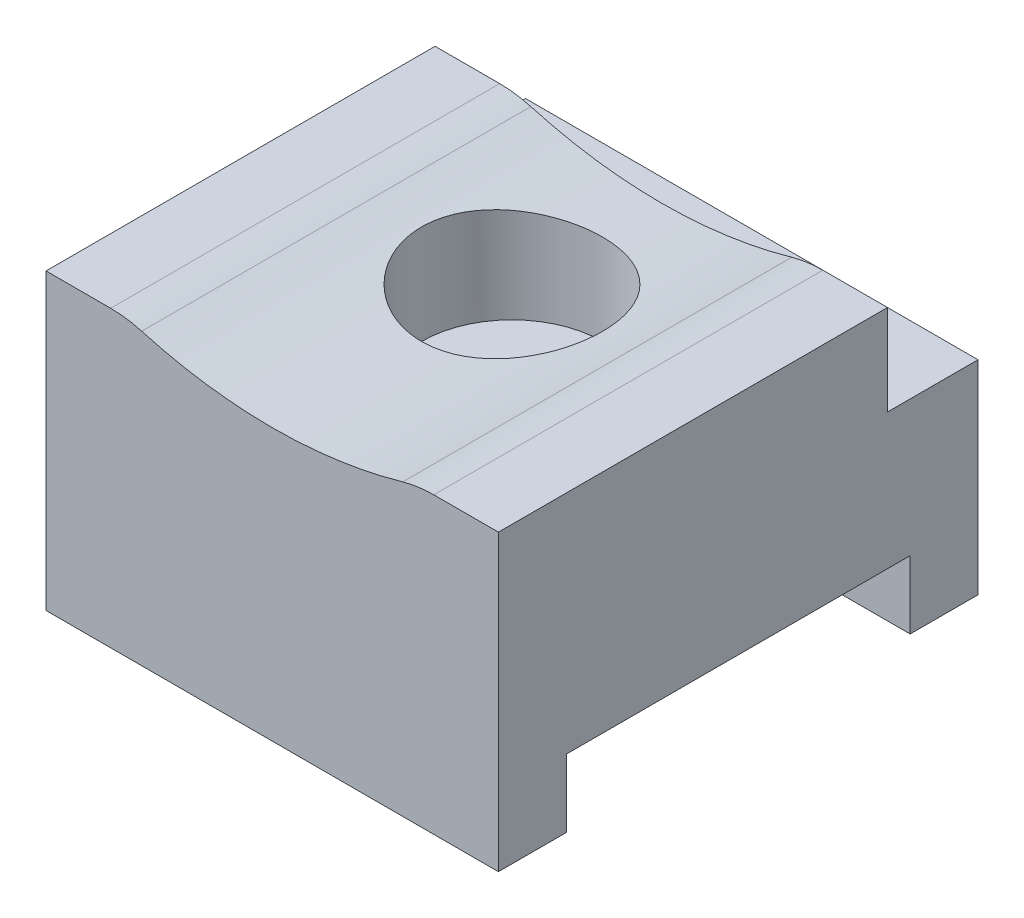
ISO-10303-21;
HEADER;
FILE_DESCRIPTION(('STEP AP214'),'2;1');
FILE_NAME('part.step','',(''),(''),'','','');
FILE_SCHEMA(('AUTOMOTIVE_DESIGN { 1 0 10303 214 1 1 1 1 }'));
ENDSEC;
DATA;
#1=APPLICATION_CONTEXT('core data for automotive mechanical design processes');
#2=APPLICATION_PROTOCOL_DEFINITION('international standard','automotive_design',2000,#1);
#3=PRODUCT_CONTEXT('',#1,'mechanical');
#4=PRODUCT('Part','Part','',(#3));
#5=PRODUCT_RELATED_PRODUCT_CATEGORY('part','',(#4));
#6=PRODUCT_DEFINITION_FORMATION('','',#4);
#7=PRODUCT_DEFINITION_CONTEXT('part definition',#1,'design');
#8=PRODUCT_DEFINITION('design','',#6,#7);
#9=PRODUCT_DEFINITION_SHAPE('','',#8);
#10=(LENGTH_UNIT() NAMED_UNIT(*) SI_UNIT(.MILLI.,.METRE.));
#11=(NAMED_UNIT(*) PLANE_ANGLE_UNIT() SI_UNIT($,.RADIAN.));
#12=(NAMED_UNIT(*) SI_UNIT($,.STERADIAN.) SOLID_ANGLE_UNIT());
#13=UNCERTAINTY_MEASURE_WITH_UNIT(LENGTH_MEASURE(1.E-05),#10,'distance_accuracy_value','');
#14=(GEOMETRIC_REPRESENTATION_CONTEXT(3) GLOBAL_UNCERTAINTY_ASSIGNED_CONTEXT((#13)) GLOBAL_UNIT_ASSIGNED_CONTEXT((#10,
#11,#12)) REPRESENTATION_CONTEXT('',''));
#15=CARTESIAN_POINT('',(0.,0.,0.));
#16=DIRECTION('',(0.,0.,1.));
#17=DIRECTION('',(1.,0.,0.));
#18=AXIS2_PLACEMENT_3D('',#15,#16,#17);
#19=CARTESIAN_POINT('',(10.,10.,0.));
#20=DIRECTION('',(0.,-1.,0.));
#21=DIRECTION('',(0.,0.,-1.));
#22=AXIS2_PLACEMENT_3D('',#19,#20,#21);
#23=CYLINDRICAL_SURFACE('',#22,1.6);
#24=CARTESIAN_POINT('',(10.,5.,0.));
#25=DIRECTION('',(0.,-1.,0.));
#26=DIRECTION('',(0.,0.,-1.));
#27=AXIS2_PLACEMENT_3D('',#24,#25,#26);
#28=CIRCLE('',#27,1.6);
#29=CARTESIAN_POINT('',(10.,5.,-1.6));
#30=VERTEX_POINT('',#29);
#31=EDGE_CURVE('E204',#30,#30,#28,.F.);
#32=ORIENTED_EDGE('',*,*,#31,.T.);
#33=EDGE_LOOP('',(#32));
#34=FACE_BOUND('',#33,.T.);
#35=CARTESIAN_POINT('',(10.,1.,0.));
#36=DIRECTION('',(0.,-1.,0.));
#37=DIRECTION('',(0.,0.,-1.));
#38=AXIS2_PLACEMENT_3D('',#35,#36,#37);
#39=CIRCLE('',#38,1.6);
#40=CARTESIAN_POINT('',(10.,1.,-1.6));
#41=VERTEX_POINT('',#40);
#42=EDGE_CURVE('E38',#41,#41,#39,.F.);
#43=ORIENTED_EDGE('',*,*,#42,.F.);
#44=EDGE_LOOP('',(#43));
#45=FACE_BOUND('',#44,.T.);
#46=ADVANCED_FACE('F34',(#34,#45),#23,.F.);
#47=CARTESIAN_POINT('',(20.,10.,10.6));
#48=DIRECTION('',(0.,-1.,0.));
#49=DIRECTION('',(0.,0.,-1.));
#50=AXIS2_PLACEMENT_3D('',#47,#48,#49);
#51=PLANE('',#50);
#52=DIRECTION('',(0.,0.,1.));
#53=VECTOR('',#52,1.);
#54=CARTESIAN_POINT('',(20.,10.,10.6));
#55=LINE('',#54,#53);
#56=CARTESIAN_POINT('',(20.,10.,-6.6));
#57=VERTEX_POINT('',#56);
#58=CARTESIAN_POINT('',(20.,10.,10.6));
#59=VERTEX_POINT('',#58);
#60=EDGE_CURVE('E266',#57,#59,#55,.T.);
#61=ORIENTED_EDGE('',*,*,#60,.F.);
#62=DIRECTION('',(1.,0.,0.));
#63=VECTOR('',#62,1.);
#64=CARTESIAN_POINT('',(0.,10.,-6.6));
#65=LINE('',#64,#63);
#66=CARTESIAN_POINT('',(17.1414284285428,10.,-6.6));
#67=VERTEX_POINT('',#66);
#68=EDGE_CURVE('E156',#67,#57,#65,.T.);
#69=ORIENTED_EDGE('',*,*,#68,.F.);
#70=DIRECTION('',(0.,0.,1.));
#71=VECTOR('',#70,1.);
#72=CARTESIAN_POINT('',(17.1414284285428,10.,10.6));
#73=LINE('',#72,#71);
#74=CARTESIAN_POINT('',(17.1414284285428,10.,10.6));
#75=VERTEX_POINT('',#74);
#76=EDGE_CURVE('E43',#67,#75,#73,.T.);
#77=ORIENTED_EDGE('',*,*,#76,.T.);
#78=DIRECTION('',(-1.,0.,0.));
#79=VECTOR('',#78,1.);
#80=CARTESIAN_POINT('',(20.,10.,10.6));
#81=LINE('',#80,#79);
#82=EDGE_CURVE('E201',#59,#75,#81,.T.);
#83=ORIENTED_EDGE('',*,*,#82,.F.);
#84=EDGE_LOOP('',(#61,#69,#77,#83));
#85=FACE_BOUND('',#84,.T.);
#86=ADVANCED_FACE('F228',(#85),#51,.F.);
#87=CARTESIAN_POINT('',(20.,10.,-10.6));
#88=DIRECTION('',(0.,0.,1.));
#89=DIRECTION('',(0.,-1.,0.));
#90=AXIS2_PLACEMENT_3D('',#87,#88,#89);
#91=PLANE('',#90);
#92=DIRECTION('',(0.,1.,0.));
#93=VECTOR('',#92,1.);
#94=CARTESIAN_POINT('',(0.,10.,-10.6));
#95=LINE('',#94,#93);
#96=CARTESIAN_POINT('',(0.,-3.,-10.6));
#97=VERTEX_POINT('',#96);
#98=CARTESIAN_POINT('',(0.,6.,-10.6));
#99=VERTEX_POINT('',#98);
#100=EDGE_CURVE('E162',#97,#99,#95,.T.);
#101=ORIENTED_EDGE('',*,*,#100,.T.);
#102=DIRECTION('',(1.,0.,0.));
#103=VECTOR('',#102,1.);
#104=CARTESIAN_POINT('',(0.,6.,-10.6));
#105=LINE('',#104,#103);
#106=CARTESIAN_POINT('',(20.,6.,-10.6));
#107=VERTEX_POINT('',#106);
#108=EDGE_CURVE('E253',#99,#107,#105,.T.);
#109=ORIENTED_EDGE('',*,*,#108,.T.);
#110=DIRECTION('',(0.,1.,0.));
#111=VECTOR('',#110,1.);
#112=CARTESIAN_POINT('',(20.,10.,-10.6));
#113=LINE('',#112,#111);
#114=CARTESIAN_POINT('',(20.,-3.,-10.6));
#115=VERTEX_POINT('',#114);
#116=EDGE_CURVE('E180',#115,#107,#113,.T.);
#117=ORIENTED_EDGE('',*,*,#116,.F.);
#118=DIRECTION('',(-1.,0.,0.));
#119=VECTOR('',#118,1.);
#120=CARTESIAN_POINT('',(20.,-3.,-10.6));
#121=LINE('',#120,#119);
#122=EDGE_CURVE('E181',#115,#97,#121,.T.);
#123=ORIENTED_EDGE('',*,*,#122,.T.);
#124=EDGE_LOOP('',(#101,#109,#117,#123));
#125=FACE_BOUND('',#124,.T.);
#126=ADVANCED_FACE('F233',(#125),#91,.F.);
#127=DIRECTION('',(0.,0.,1.));
#128=VECTOR('',#127,1.);
#129=CARTESIAN_POINT('',(2.85857157145716,10.,10.6));
#130=LINE('',#129,#128);
#131=CARTESIAN_POINT('',(2.85857157145716,10.,10.6));
#132=VERTEX_POINT('',#131);
#133=CARTESIAN_POINT('',(2.85857157145716,10.,-6.6));
#134=VERTEX_POINT('',#133);
#135=EDGE_CURVE('E155',#132,#134,#130,.F.);
#136=ORIENTED_EDGE('',*,*,#135,.T.);
#137=CARTESIAN_POINT('',(0.,10.,-6.6));
#138=VERTEX_POINT('',#137);
#139=EDGE_CURVE('E137',#138,#134,#65,.T.);
#140=ORIENTED_EDGE('',*,*,#139,.F.);
#141=DIRECTION('',(0.,0.,1.));
#142=VECTOR('',#141,1.);
#143=CARTESIAN_POINT('',(0.,10.,10.6));
#144=LINE('',#143,#142);
#145=CARTESIAN_POINT('',(0.,10.,10.6));
#146=VERTEX_POINT('',#145);
#147=EDGE_CURVE('E152',#138,#146,#144,.T.);
#148=ORIENTED_EDGE('',*,*,#147,.T.);
#149=EDGE_CURVE('E200',#132,#146,#81,.T.);
#150=ORIENTED_EDGE('',*,*,#149,.F.);
#151=EDGE_LOOP('',(#136,#140,#148,#150));
#152=FACE_BOUND('',#151,.T.);
#153=ADVANCED_FACE('F150',(#152),#51,.F.);
#154=CARTESIAN_POINT('',(20.,10.,10.6));
#155=DIRECTION('',(0.,0.,-1.));
#156=DIRECTION('',(0.,1.,0.));
#157=AXIS2_PLACEMENT_3D('',#154,#155,#156);
#158=PLANE('',#157);
#159=CARTESIAN_POINT('',(10.,30.,10.6));
#160=DIRECTION('',(0.,0.,1.));
#161=DIRECTION('',(1.,0.,0.));
#162=AXIS2_PLACEMENT_3D('',#159,#160,#161);
#163=CIRCLE('',#162,21.);
#164=CARTESIAN_POINT('',(4.23192319233079,9.80769230769231,10.6));
#165=VERTEX_POINT('',#164);
#166=CARTESIAN_POINT('',(15.7680768076692,9.80769230769231,10.6));
#167=VERTEX_POINT('',#166);
#168=EDGE_CURVE('E167',#165,#167,#163,.T.);
#169=ORIENTED_EDGE('',*,*,#168,.F.);
#170=CARTESIAN_POINT('',(2.85857157145716,5.,10.6));
#171=DIRECTION('',(0.,0.,-1.));
#172=DIRECTION('',(0.,1.,0.));
#173=AXIS2_PLACEMENT_3D('',#170,#171,#172);
#174=CIRCLE('',#173,5.);
#175=EDGE_CURVE('E315',#165,#132,#174,.F.);
#176=ORIENTED_EDGE('',*,*,#175,.T.);
#177=ORIENTED_EDGE('',*,*,#149,.T.);
#178=DIRECTION('',(0.,-1.,0.));
#179=VECTOR('',#178,1.);
#180=CARTESIAN_POINT('',(0.,10.,10.6));
#181=LINE('',#180,#179);
#182=CARTESIAN_POINT('',(0.,-3.,10.6));
#183=VERTEX_POINT('',#182);
#184=EDGE_CURVE('E161',#146,#183,#181,.T.);
#185=ORIENTED_EDGE('',*,*,#184,.T.);
#186=DIRECTION('',(-1.,0.,0.));
#187=VECTOR('',#186,1.);
#188=CARTESIAN_POINT('',(20.,-3.,10.6));
#189=LINE('',#188,#187);
#190=CARTESIAN_POINT('',(20.,-3.,10.6));
#191=VERTEX_POINT('',#190);
#192=EDGE_CURVE('E197',#191,#183,#189,.T.);
#193=ORIENTED_EDGE('',*,*,#192,.F.);
#194=DIRECTION('',(0.,-1.,0.));
#195=VECTOR('',#194,1.);
#196=CARTESIAN_POINT('',(20.,10.,10.6));
#197=LINE('',#196,#195);
#198=EDGE_CURVE('E268',#59,#191,#197,.T.);
#199=ORIENTED_EDGE('',*,*,#198,.F.);
#200=ORIENTED_EDGE('',*,*,#82,.T.);
#201=CARTESIAN_POINT('',(17.1414284285428,5.,10.6));
#202=DIRECTION('',(0.,0.,-1.));
#203=DIRECTION('',(0.,1.,0.));
#204=AXIS2_PLACEMENT_3D('',#201,#202,#203);
#205=CIRCLE('',#204,5.);
#206=EDGE_CURVE('E324',#75,#167,#205,.F.);
#207=ORIENTED_EDGE('',*,*,#206,.T.);
#208=EDGE_LOOP('',(#169,#176,#177,#185,#193,#199,#200,#207));
#209=FACE_BOUND('',#208,.T.);
#210=ADVANCED_FACE('F313',(#209),#158,.F.);
#211=CARTESIAN_POINT('',(20.,-3.,10.6));
#212=DIRECTION('',(0.,1.,0.));
#213=DIRECTION('',(0.,0.,1.));
#214=AXIS2_PLACEMENT_3D('',#211,#212,#213);
#215=PLANE('',#214);
#216=DIRECTION('',(0.,0.,-1.));
#217=VECTOR('',#216,1.);
#218=CARTESIAN_POINT('',(0.,-3.,10.6));
#219=LINE('',#218,#217);
#220=CARTESIAN_POINT('',(0.,-3.,7.6));
#221=VERTEX_POINT('',#220);
#222=EDGE_CURVE('E164',#183,#221,#219,.T.);
#223=ORIENTED_EDGE('',*,*,#222,.T.);
#224=DIRECTION('',(-1.,0.,0.));
#225=VECTOR('',#224,1.);
#226=CARTESIAN_POINT('',(20.,-3.,7.6));
#227=LINE('',#226,#225);
#228=CARTESIAN_POINT('',(20.,-3.,7.6));
#229=VERTEX_POINT('',#228);
#230=EDGE_CURVE('E194',#229,#221,#227,.T.);
#231=ORIENTED_EDGE('',*,*,#230,.F.);
#232=DIRECTION('',(0.,0.,-1.));
#233=VECTOR('',#232,1.);
#234=CARTESIAN_POINT('',(20.,-3.,10.6));
#235=LINE('',#234,#233);
#236=EDGE_CURVE('E270',#191,#229,#235,.T.);
#237=ORIENTED_EDGE('',*,*,#236,.F.);
#238=ORIENTED_EDGE('',*,*,#192,.T.);
#239=EDGE_LOOP('',(#223,#231,#237,#238));
#240=FACE_BOUND('',#239,.T.);
#241=ADVANCED_FACE('F307',(#240),#215,.F.);
#242=CARTESIAN_POINT('',(20.,-3.,7.6));
#243=DIRECTION('',(0.,0.,1.));
#244=DIRECTION('',(1.,0.,0.));
#245=AXIS2_PLACEMENT_3D('',#242,#243,#244);
#246=PLANE('',#245);
#247=DIRECTION('',(0.,1.,0.));
#248=VECTOR('',#247,1.);
#249=CARTESIAN_POINT('',(0.,-3.,7.6));
#250=LINE('',#249,#248);
#251=CARTESIAN_POINT('',(0.,0.,7.6));
#252=VERTEX_POINT('',#251);
#253=EDGE_CURVE('E172',#221,#252,#250,.T.);
#254=ORIENTED_EDGE('',*,*,#253,.T.);
#255=DIRECTION('',(-1.,0.,0.));
#256=VECTOR('',#255,1.);
#257=CARTESIAN_POINT('',(20.,0.,7.6));
#258=LINE('',#257,#256);
#259=CARTESIAN_POINT('',(20.,0.,7.6));
#260=VERTEX_POINT('',#259);
#261=EDGE_CURVE('E191',#260,#252,#258,.T.);
#262=ORIENTED_EDGE('',*,*,#261,.F.);
#263=DIRECTION('',(0.,1.,0.));
#264=VECTOR('',#263,1.);
#265=CARTESIAN_POINT('',(20.,-3.,7.6));
#266=LINE('',#265,#264);
#267=EDGE_CURVE('E272',#229,#260,#266,.T.);
#268=ORIENTED_EDGE('',*,*,#267,.F.);
#269=ORIENTED_EDGE('',*,*,#230,.T.);
#270=EDGE_LOOP('',(#254,#262,#268,#269));
#271=FACE_BOUND('',#270,.T.);
#272=ADVANCED_FACE('F304',(#271),#246,.F.);
#273=CARTESIAN_POINT('',(20.,0.,-7.6));
#274=DIRECTION('',(0.,1.,0.));
#275=DIRECTION('',(0.,0.,1.));
#276=AXIS2_PLACEMENT_3D('',#273,#274,#275);
#277=PLANE('',#276);
#278=CARTESIAN_POINT('',(10.,0.,0.));
#279=DIRECTION('',(0.,-1.,0.));
#280=DIRECTION('',(0.,0.,-1.));
#281=AXIS2_PLACEMENT_3D('',#278,#279,#280);
#282=CIRCLE('',#281,4.);
#283=CARTESIAN_POINT('',(10.,0.,-4.));
#284=VERTEX_POINT('',#283);
#285=EDGE_CURVE('E244',#284,#284,#282,.T.);
#286=ORIENTED_EDGE('',*,*,#285,.F.);
#287=EDGE_LOOP('',(#286));
#288=FACE_BOUND('',#287,.T.);
#289=DIRECTION('',(0.,0.,-1.));
#290=VECTOR('',#289,1.);
#291=CARTESIAN_POINT('',(0.,0.,-7.6));
#292=LINE('',#291,#290);
#293=CARTESIAN_POINT('',(0.,0.,-7.6));
#294=VERTEX_POINT('',#293);
#295=EDGE_CURVE('E174',#252,#294,#292,.T.);
#296=ORIENTED_EDGE('',*,*,#295,.T.);
#297=DIRECTION('',(-1.,0.,0.));
#298=VECTOR('',#297,1.);
#299=CARTESIAN_POINT('',(20.,0.,-7.6));
#300=LINE('',#299,#298);
#301=CARTESIAN_POINT('',(20.,0.,-7.6));
#302=VERTEX_POINT('',#301);
#303=EDGE_CURVE('E188',#302,#294,#300,.T.);
#304=ORIENTED_EDGE('',*,*,#303,.F.);
#305=DIRECTION('',(0.,0.,-1.));
#306=VECTOR('',#305,1.);
#307=CARTESIAN_POINT('',(20.,0.,-7.6));
#308=LINE('',#307,#306);
#309=EDGE_CURVE('E274',#260,#302,#308,.T.);
#310=ORIENTED_EDGE('',*,*,#309,.F.);
#311=ORIENTED_EDGE('',*,*,#261,.T.);
#312=EDGE_LOOP('',(#296,#304,#310,#311));
#313=FACE_BOUND('',#312,.T.);
#314=ADVANCED_FACE('F300',(#288,#313),#277,.F.);
#315=CARTESIAN_POINT('',(20.,-3.,-7.6));
#316=DIRECTION('',(0.,0.,-1.));
#317=DIRECTION('',(-1.,0.,0.));
#318=AXIS2_PLACEMENT_3D('',#315,#316,#317);
#319=PLANE('',#318);
#320=DIRECTION('',(0.,-1.,0.));
#321=VECTOR('',#320,1.);
#322=CARTESIAN_POINT('',(0.,-3.,-7.6));
#323=LINE('',#322,#321);
#324=CARTESIAN_POINT('',(0.,-3.,-7.6));
#325=VERTEX_POINT('',#324);
#326=EDGE_CURVE('E176',#294,#325,#323,.T.);
#327=ORIENTED_EDGE('',*,*,#326,.T.);
#328=DIRECTION('',(-1.,0.,0.));
#329=VECTOR('',#328,1.);
#330=CARTESIAN_POINT('',(20.,-3.,-7.6));
#331=LINE('',#330,#329);
#332=CARTESIAN_POINT('',(20.,-3.,-7.6));
#333=VERTEX_POINT('',#332);
#334=EDGE_CURVE('E184',#333,#325,#331,.T.);
#335=ORIENTED_EDGE('',*,*,#334,.F.);
#336=DIRECTION('',(0.,-1.,0.));
#337=VECTOR('',#336,1.);
#338=CARTESIAN_POINT('',(20.,-3.,-7.6));
#339=LINE('',#338,#337);
#340=EDGE_CURVE('E276',#302,#333,#339,.T.);
#341=ORIENTED_EDGE('',*,*,#340,.F.);
#342=ORIENTED_EDGE('',*,*,#303,.T.);
#343=EDGE_LOOP('',(#327,#335,#341,#342));
#344=FACE_BOUND('',#343,.T.);
#345=ADVANCED_FACE('F296',(#344),#319,.F.);
#346=CARTESIAN_POINT('',(20.,-3.,-10.6));
#347=DIRECTION('',(0.,1.,0.));
#348=DIRECTION('',(0.,0.,1.));
#349=AXIS2_PLACEMENT_3D('',#346,#347,#348);
#350=PLANE('',#349);
#351=DIRECTION('',(0.,0.,-1.));
#352=VECTOR('',#351,1.);
#353=CARTESIAN_POINT('',(0.,-3.,-10.6));
#354=LINE('',#353,#352);
#355=EDGE_CURVE('E178',#325,#97,#354,.T.);
#356=ORIENTED_EDGE('',*,*,#355,.T.);
#357=ORIENTED_EDGE('',*,*,#122,.F.);
#358=DIRECTION('',(0.,0.,-1.));
#359=VECTOR('',#358,1.);
#360=CARTESIAN_POINT('',(20.,-3.,-10.6));
#361=LINE('',#360,#359);
#362=EDGE_CURVE('E185',#333,#115,#361,.T.);
#363=ORIENTED_EDGE('',*,*,#362,.F.);
#364=ORIENTED_EDGE('',*,*,#334,.T.);
#365=EDGE_LOOP('',(#356,#357,#363,#364));
#366=FACE_BOUND('',#365,.T.);
#367=ADVANCED_FACE('F286',(#366),#350,.F.);
#368=CARTESIAN_POINT('',(20.,0.,0.));
#369=DIRECTION('',(-1.,0.,0.));
#370=DIRECTION('',(0.,0.,1.));
#371=AXIS2_PLACEMENT_3D('',#368,#369,#370);
#372=PLANE('',#371);
#373=ORIENTED_EDGE('',*,*,#116,.T.);
#374=DIRECTION('',(0.,0.,-1.));
#375=VECTOR('',#374,1.);
#376=CARTESIAN_POINT('',(20.,6.,-10.6));
#377=LINE('',#376,#375);
#378=CARTESIAN_POINT('',(20.,6.,-6.6));
#379=VERTEX_POINT('',#378);
#380=EDGE_CURVE('E146',#379,#107,#377,.T.);
#381=ORIENTED_EDGE('',*,*,#380,.F.);
#382=DIRECTION('',(0.,-1.,0.));
#383=VECTOR('',#382,1.);
#384=CARTESIAN_POINT('',(20.,10.,-6.6));
#385=LINE('',#384,#383);
#386=EDGE_CURVE('E240',#57,#379,#385,.T.);
#387=ORIENTED_EDGE('',*,*,#386,.F.);
#388=ORIENTED_EDGE('',*,*,#60,.T.);
#389=ORIENTED_EDGE('',*,*,#198,.T.);
#390=ORIENTED_EDGE('',*,*,#236,.T.);
#391=ORIENTED_EDGE('',*,*,#267,.T.);
#392=ORIENTED_EDGE('',*,*,#309,.T.);
#393=ORIENTED_EDGE('',*,*,#340,.T.);
#394=ORIENTED_EDGE('',*,*,#362,.T.);
#395=EDGE_LOOP('',(#373,#381,#387,#388,#389,#390,#391,#392,#393,#394));
#396=FACE_BOUND('',#395,.T.);
#397=ADVANCED_FACE('F280',(#396),#372,.F.);
#398=CARTESIAN_POINT('',(0.,0.,0.));
#399=DIRECTION('',(-1.,0.,0.));
#400=DIRECTION('',(0.,0.,1.));
#401=AXIS2_PLACEMENT_3D('',#398,#399,#400);
#402=PLANE('',#401);
#403=DIRECTION('',(0.,0.,-1.));
#404=VECTOR('',#403,1.);
#405=CARTESIAN_POINT('',(0.,6.,-10.6));
#406=LINE('',#405,#404);
#407=CARTESIAN_POINT('',(0.,6.,-6.6));
#408=VERTEX_POINT('',#407);
#409=EDGE_CURVE('E145',#408,#99,#406,.T.);
#410=ORIENTED_EDGE('',*,*,#409,.T.);
#411=ORIENTED_EDGE('',*,*,#100,.F.);
#412=ORIENTED_EDGE('',*,*,#355,.F.);
#413=ORIENTED_EDGE('',*,*,#326,.F.);
#414=ORIENTED_EDGE('',*,*,#295,.F.);
#415=ORIENTED_EDGE('',*,*,#253,.F.);
#416=ORIENTED_EDGE('',*,*,#222,.F.);
#417=ORIENTED_EDGE('',*,*,#184,.F.);
#418=ORIENTED_EDGE('',*,*,#147,.F.);
#419=DIRECTION('',(0.,-1.,0.));
#420=VECTOR('',#419,1.);
#421=CARTESIAN_POINT('',(0.,10.,-6.6));
#422=LINE('',#421,#420);
#423=EDGE_CURVE('E134',#138,#408,#422,.T.);
#424=ORIENTED_EDGE('',*,*,#423,.T.);
#425=EDGE_LOOP('',(#410,#411,#412,#413,#414,#415,#416,#417,#418,#424));
#426=FACE_BOUND('',#425,.T.);
#427=ADVANCED_FACE('F159',(#426),#402,.T.);
#428=CARTESIAN_POINT('',(10.,30.,-10.6));
#429=DIRECTION('',(0.,0.,1.));
#430=DIRECTION('',(1.,0.,0.));
#431=AXIS2_PLACEMENT_3D('',#428,#429,#430);
#432=CYLINDRICAL_SURFACE('',#431,21.);
#433=CARTESIAN_POINT('',(10.,9.00000000000001,-4.));
#434=CARTESIAN_POINT('',(10.2225253464136,9.00000405121422,-3.99999156757274));
#435=CARTESIAN_POINT('',(10.4451596701968,9.00357343480443,-3.98136817942133));
#436=CARTESIAN_POINT('',(10.8841501316962,9.0174683164847,-3.90741725047668));
#437=CARTESIAN_POINT('',(11.1005008864806,9.02779943864101,-3.85205915511171));
#438=CARTESIAN_POINT('',(11.5205123646574,9.05406260720211,-3.70639899435064));
#439=CARTESIAN_POINT('',(11.7241845129138,9.06998952257117,-3.6161289336973));
#440=CARTESIAN_POINT('',(12.1134748925998,9.10570689350073,-3.40329912601502));
#441=CARTESIAN_POINT('',(12.2990944935943,9.12549705563112,-3.28074183109249));
#442=CARTESIAN_POINT('',(12.6493190952768,9.16703109904082,-3.00521146842331));
#443=CARTESIAN_POINT('',(12.8136691205766,9.18879415849123,-2.85191716125106));
#444=CARTESIAN_POINT('',(13.114483018869,9.2316794823809,-2.51995515780807));
#445=CARTESIAN_POINT('',(13.2509448490612,9.25280169978228,-2.34128560443321));
#446=CARTESIAN_POINT('',(13.4931749838319,9.29220041605333,-1.96183546158884));
#447=CARTESIAN_POINT('',(13.5986828350734,9.31045219944302,-1.76088581378005));
#448=CARTESIAN_POINT('',(13.7743424265218,9.34177278716155,-1.34370731479453));
#449=CARTESIAN_POINT('',(13.84449731816,9.35484205344785,-1.12747982747397));
#450=CARTESIAN_POINT('',(13.9466390406593,9.37412459417722,-0.688615314441854));
#451=CARTESIAN_POINT('',(13.9790711692912,9.3804177893302,-0.466085509296565));
#452=CARTESIAN_POINT('',(14.0062291392895,9.38567651227795,-0.0186607990790324));
#453=CARTESIAN_POINT('',(14.0009584716877,9.38464271850395,0.206233885095474));
#454=CARTESIAN_POINT('',(13.9532212986318,9.3754369980249,0.648770925490681));
#455=CARTESIAN_POINT('',(13.911262102866,9.36736243161663,0.86647033114741));
#456=CARTESIAN_POINT('',(13.7921383035676,9.34513797997124,1.29168216085779));
#457=CARTESIAN_POINT('',(13.7149721607259,9.33098782910057,1.49919413905993));
#458=CARTESIAN_POINT('',(13.5271315344888,9.29810531796565,1.89961976804214));
#459=CARTESIAN_POINT('',(13.4162530838746,9.27934520270695,2.09243536390356));
#460=CARTESIAN_POINT('',(13.1642794471297,9.23937478298079,2.45691531620977));
#461=CARTESIAN_POINT('',(13.0231810995992,9.21816422227142,2.628577456762));
#462=CARTESIAN_POINT('',(12.7120421576144,9.17525914889316,2.94880786105613));
#463=CARTESIAN_POINT('',(12.5415678606191,9.15356237841422,3.09695475455825));
#464=CARTESIAN_POINT('',(12.1779650797633,9.1124465730538,3.36261247743639));
#465=CARTESIAN_POINT('',(11.9848363547921,9.09302756241888,3.48012298070693));
#466=CARTESIAN_POINT('',(11.5809607638612,9.05861415621487,3.68123799167681));
#467=CARTESIAN_POINT('',(11.3701910414956,9.04362561848366,3.76479766476885));
#468=CARTESIAN_POINT('',(10.9372574802418,9.01980702868141,3.89520764348015));
#469=CARTESIAN_POINT('',(10.7150948939755,9.01097630112373,3.94206197559507));
#470=CARTESIAN_POINT('',(10.2693062043329,9.00056139983454,3.99714240727228));
#471=CARTESIAN_POINT('',(10.0457538641059,8.99886895813353,4.00594568700039));
#472=CARTESIAN_POINT('',(9.60037177838591,9.002621866664,3.98622378940306));
#473=CARTESIAN_POINT('',(9.3785419460109,9.00806685450577,3.95770050726449));
#474=CARTESIAN_POINT('',(8.94473982385613,9.02541531902806,3.86461494733687));
#475=CARTESIAN_POINT('',(8.73270237635871,9.03726626477203,3.80034567587215));
#476=CARTESIAN_POINT('',(8.32241257267235,9.06610317797662,3.63791030505879));
#477=CARTESIAN_POINT('',(8.12416117672787,9.08308950269372,3.53974184735428));
#478=CARTESIAN_POINT('',(7.74461459754637,9.120583003995,3.31102398965083));
#479=CARTESIAN_POINT('',(7.56353498746095,9.14112759995831,3.18012311659075));
#480=CARTESIAN_POINT('',(7.2257050812798,9.18336423319863,2.89013066233263));
#481=CARTESIAN_POINT('',(7.06895713756509,9.20505638114926,2.73103635857934));
#482=CARTESIAN_POINT('',(6.78203884465025,9.24750380663602,2.38655670100492));
#483=CARTESIAN_POINT('',(6.65226294240618,9.26824213230829,2.20084037121594));
#484=CARTESIAN_POINT('',(6.42574870987309,9.30608856281899,1.80990486059977));
#485=CARTESIAN_POINT('',(6.32900912815791,9.32319680515682,1.60468641889521));
#486=CARTESIAN_POINT('',(6.17186805328841,9.35171206763768,1.18155805584685));
#487=CARTESIAN_POINT('',(6.11128813105362,9.36314703440297,0.963716371164708));
#488=CARTESIAN_POINT('',(6.02763777558745,9.37908382763134,0.520707457047768));
#489=CARTESIAN_POINT('',(6.00456295883759,9.38358646432745,0.295541086845185));
#490=CARTESIAN_POINT('',(5.99672814432769,9.38510678641057,-0.151772378465416));
#491=CARTESIAN_POINT('',(6.01134570094987,9.38224607038726,-0.373908395352328));
#492=CARTESIAN_POINT('',(6.07711538737255,9.36963212794138,-0.812494592273746));
#493=CARTESIAN_POINT('',(6.12826728211054,9.35987894586505,-1.02894480888149));
#494=CARTESIAN_POINT('',(6.26538746283103,9.33463095842716,-1.44966609710993));
#495=CARTESIAN_POINT('',(6.35128626488271,9.31914761698235,-1.65396054701291));
#496=CARTESIAN_POINT('',(6.55539307322626,9.28417616329607,-2.04533695238608));
#497=CARTESIAN_POINT('',(6.6736034625885,9.26468775569604,-2.23241763693191));
#498=CARTESIAN_POINT('',(6.94113302704904,9.22352581399874,-2.58716963531981));
#499=CARTESIAN_POINT('',(7.09090439819394,9.20182318417356,-2.75449661735999));
#500=CARTESIAN_POINT('',(7.41636366609996,9.15889373053123,-3.06185068002893));
#501=CARTESIAN_POINT('',(7.59205750776431,9.13766701714765,-3.20187148127532));
#502=CARTESIAN_POINT('',(7.96634124476478,9.0978483006026,-3.45186302573133));
#503=CARTESIAN_POINT('',(8.16512959990653,9.07928274768918,-3.56154099081428));
#504=CARTESIAN_POINT('',(8.57860422468189,9.04713690711574,-3.74576567680701));
#505=CARTESIAN_POINT('',(8.79327548498309,9.03355198328863,-3.8203450872834));
#506=CARTESIAN_POINT('',(9.17378662883016,9.01563745711993,-3.9172747456815));
#507=CARTESIAN_POINT('',(9.33741511284519,9.0098068052182,-3.948243169922));
#508=CARTESIAN_POINT('',(9.66734214321056,9.00198661386915,-3.98960867303412));
#509=CARTESIAN_POINT('',(9.83364061777298,8.99999697132258,-4.00000630406114));
#510=CARTESIAN_POINT('',(10.,9.00000000000001,-4.));
#511=B_SPLINE_CURVE_WITH_KNOTS('',3,(#433,#434,#435,#436,#437,#438,#439,#440,#441,#442,#443,
#444,#445,#446,#447,#448,#449,#450,#451,#452,#453,#454,#455,#456,#457,#458,#459,#460,#461,#462,
#463,#464,#465,#466,#467,#468,#469,#470,#471,#472,#473,#474,#475,#476,#477,#478,#479,#480,#481,
#482,#483,#484,#485,#486,#487,#488,#489,#490,#491,#492,#493,#494,#495,#496,#497,#498,#499,#500,
#501,#502,#503,#504,#505,#506,#507,#508,#509,#510),.UNSPECIFIED.,.T.,.F.,(4,2,2,2,2,2,2,2,2,2,2,
2,2,2,2,2,2,2,2,2,2,2,2,2,2,2,2,2,2,2,2,2,2,2,2,2,2,2,4),(0.,0.66696760486008,1.33449066524751,
2.00140323416555,2.66826516792031,3.34249856607468,4.01678133389621,4.69658484012307,
5.37632773662501,6.04796246275301,6.71953500071262,7.3819656731475,8.04442531098234,
8.71097554773153,9.37759554851544,10.0550659118846,10.7325434862135,11.4109128349907,
12.0892077577089,12.7571769860267,13.4251123007632,14.0876516303946,14.7502370619713,
15.4202680573965,16.0903637910035,16.7696596694033,17.4489298130073,18.1248197916381,
18.8006307679764,19.4653532478618,20.1300714509506,20.7934669265872,21.4569113427121,
22.130600717736,22.8044448334632,23.4845805034207,24.1640814590101,24.6627181261437,
25.1613414088313),.UNSPECIFIED.);
#512=CARTESIAN_POINT('',(10.,9.00000000000001,-4.));
#513=VERTEX_POINT('',#512);
#514=EDGE_CURVE('E207',#513,#513,#511,.T.);
#515=ORIENTED_EDGE('',*,*,#514,.T.);
#516=EDGE_LOOP('',(#515));
#517=FACE_BOUND('',#516,.T.);
#518=DIRECTION('',(0.,0.,1.));
#519=VECTOR('',#518,1.);
#520=CARTESIAN_POINT('',(15.7680768076692,9.8076923076923,-10.6));
#521=LINE('',#520,#519);
#522=CARTESIAN_POINT('',(15.7680768076692,9.8076923076923,-6.6));
#523=VERTEX_POINT('',#522);
#524=EDGE_CURVE('E319',#167,#523,#521,.F.);
#525=ORIENTED_EDGE('',*,*,#524,.T.);
#526=CARTESIAN_POINT('',(10.,30.,-6.6));
#527=DIRECTION('',(0.,0.,1.));
#528=DIRECTION('',(1.,0.,0.));
#529=AXIS2_PLACEMENT_3D('',#526,#527,#528);
#530=CIRCLE('',#529,21.);
#531=CARTESIAN_POINT('',(4.23192319233079,9.80769230769231,-6.6));
#532=VERTEX_POINT('',#531);
#533=EDGE_CURVE('E49',#523,#532,#530,.F.);
#534=ORIENTED_EDGE('',*,*,#533,.T.);
#535=DIRECTION('',(0.,0.,1.));
#536=VECTOR('',#535,1.);
#537=CARTESIAN_POINT('',(4.23192319233079,9.8076923076923,-10.6));
#538=LINE('',#537,#536);
#539=EDGE_CURVE('E321',#532,#165,#538,.T.);
#540=ORIENTED_EDGE('',*,*,#539,.T.);
#541=ORIENTED_EDGE('',*,*,#168,.T.);
#542=EDGE_LOOP('',(#525,#534,#540,#541));
#543=FACE_BOUND('',#542,.T.);
#544=ADVANCED_FACE('F216',(#517,#543),#432,.F.);
#545=CARTESIAN_POINT('',(10.,10.,0.));
#546=DIRECTION('',(0.,-1.,0.));
#547=DIRECTION('',(0.,0.,-1.));
#548=AXIS2_PLACEMENT_3D('',#545,#546,#547);
#549=CYLINDRICAL_SURFACE('',#548,4.);
#550=CARTESIAN_POINT('',(10.,5.,0.));
#551=DIRECTION('',(0.,-1.,0.));
#552=DIRECTION('',(0.,0.,-1.));
#553=AXIS2_PLACEMENT_3D('',#550,#551,#552);
#554=CIRCLE('',#553,4.);
#555=CARTESIAN_POINT('',(10.,5.,-4.));
#556=VERTEX_POINT('',#555);
#557=EDGE_CURVE('E208',#556,#556,#554,.T.);
#558=ORIENTED_EDGE('',*,*,#557,.T.);
#559=EDGE_LOOP('',(#558));
#560=FACE_BOUND('',#559,.T.);
#561=ORIENTED_EDGE('',*,*,#514,.F.);
#562=EDGE_LOOP('',(#561));
#563=FACE_BOUND('',#562,.T.);
#564=ADVANCED_FACE('F220',(#560,#563),#549,.F.);
#565=CARTESIAN_POINT('',(10.,5.,0.));
#566=DIRECTION('',(0.,-1.,0.));
#567=DIRECTION('',(0.,0.,-1.));
#568=AXIS2_PLACEMENT_3D('',#565,#566,#567);
#569=PLANE('',#568);
#570=ORIENTED_EDGE('',*,*,#557,.F.);
#571=EDGE_LOOP('',(#570));
#572=FACE_BOUND('',#571,.T.);
#573=ORIENTED_EDGE('',*,*,#31,.F.);
#574=EDGE_LOOP('',(#573));
#575=FACE_BOUND('',#574,.T.);
#576=ADVANCED_FACE('F224',(#572,#575),#569,.F.);
#577=CARTESIAN_POINT('',(2.85857157145716,5.,-10.6));
#578=DIRECTION('',(0.,0.,1.));
#579=DIRECTION('',(1.,0.,0.));
#580=AXIS2_PLACEMENT_3D('',#577,#578,#579);
#581=CYLINDRICAL_SURFACE('',#580,5.);
#582=CARTESIAN_POINT('',(2.85857157145716,5.,-6.6));
#583=DIRECTION('',(0.,0.,1.));
#584=DIRECTION('',(1.,0.,0.));
#585=AXIS2_PLACEMENT_3D('',#582,#583,#584);
#586=CIRCLE('',#585,5.);
#587=EDGE_CURVE('E258',#134,#532,#586,.F.);
#588=ORIENTED_EDGE('',*,*,#587,.F.);
#589=ORIENTED_EDGE('',*,*,#135,.F.);
#590=ORIENTED_EDGE('',*,*,#175,.F.);
#591=ORIENTED_EDGE('',*,*,#539,.F.);
#592=EDGE_LOOP('',(#588,#589,#590,#591));
#593=FACE_BOUND('',#592,.T.);
#594=ADVANCED_FACE('F317',(#593),#581,.T.);
#595=CARTESIAN_POINT('',(17.1414284285428,5.,-10.6));
#596=DIRECTION('',(0.,0.,1.));
#597=DIRECTION('',(1.,0.,0.));
#598=AXIS2_PLACEMENT_3D('',#595,#596,#597);
#599=CYLINDRICAL_SURFACE('',#598,5.);
#600=CARTESIAN_POINT('',(17.1414284285428,5.,-6.6));
#601=DIRECTION('',(0.,0.,1.));
#602=DIRECTION('',(1.,0.,0.));
#603=AXIS2_PLACEMENT_3D('',#600,#601,#602);
#604=CIRCLE('',#603,5.);
#605=EDGE_CURVE('E11',#523,#67,#604,.F.);
#606=ORIENTED_EDGE('',*,*,#605,.F.);
#607=ORIENTED_EDGE('',*,*,#524,.F.);
#608=ORIENTED_EDGE('',*,*,#206,.F.);
#609=ORIENTED_EDGE('',*,*,#76,.F.);
#610=EDGE_LOOP('',(#606,#607,#608,#609));
#611=FACE_BOUND('',#610,.T.);
#612=ADVANCED_FACE('F36',(#611),#599,.T.);
#613=CARTESIAN_POINT('',(0.,6.,-10.6));
#614=DIRECTION('',(0.,-1.,0.));
#615=DIRECTION('',(0.,0.,-1.));
#616=AXIS2_PLACEMENT_3D('',#613,#614,#615);
#617=PLANE('',#616);
#618=ORIENTED_EDGE('',*,*,#380,.T.);
#619=ORIENTED_EDGE('',*,*,#108,.F.);
#620=ORIENTED_EDGE('',*,*,#409,.F.);
#621=DIRECTION('',(1.,0.,0.));
#622=VECTOR('',#621,1.);
#623=CARTESIAN_POINT('',(0.,6.,-6.6));
#624=LINE('',#623,#622);
#625=EDGE_CURVE('E140',#408,#379,#624,.T.);
#626=ORIENTED_EDGE('',*,*,#625,.T.);
#627=EDGE_LOOP('',(#618,#619,#620,#626));
#628=FACE_BOUND('',#627,.T.);
#629=ADVANCED_FACE('F291',(#628),#617,.F.);
#630=CARTESIAN_POINT('',(0.,10.,-6.6));
#631=DIRECTION('',(0.,0.,1.));
#632=DIRECTION('',(1.,0.,0.));
#633=AXIS2_PLACEMENT_3D('',#630,#631,#632);
#634=PLANE('',#633);
#635=ORIENTED_EDGE('',*,*,#587,.T.);
#636=ORIENTED_EDGE('',*,*,#533,.F.);
#637=ORIENTED_EDGE('',*,*,#605,.T.);
#638=ORIENTED_EDGE('',*,*,#68,.T.);
#639=ORIENTED_EDGE('',*,*,#386,.T.);
#640=ORIENTED_EDGE('',*,*,#625,.F.);
#641=ORIENTED_EDGE('',*,*,#423,.F.);
#642=ORIENTED_EDGE('',*,*,#139,.T.);
#643=EDGE_LOOP('',(#635,#636,#637,#638,#639,#640,#641,#642));
#644=FACE_BOUND('',#643,.T.);
#645=ADVANCED_FACE('F136',(#644),#634,.F.);
#646=CARTESIAN_POINT('',(10.,1.,0.));
#647=DIRECTION('',(0.,-1.,0.));
#648=DIRECTION('',(0.,0.,-1.));
#649=AXIS2_PLACEMENT_3D('',#646,#647,#648);
#650=PLANE('',#649);
#651=CARTESIAN_POINT('',(10.,1.,0.));
#652=DIRECTION('',(0.,-1.,0.));
#653=DIRECTION('',(0.,0.,-1.));
#654=AXIS2_PLACEMENT_3D('',#651,#652,#653);
#655=CIRCLE('',#654,4.);
#656=CARTESIAN_POINT('',(10.,1.,-4.));
#657=VERTEX_POINT('',#656);
#658=EDGE_CURVE('E241',#657,#657,#655,.T.);
#659=ORIENTED_EDGE('',*,*,#658,.T.);
#660=EDGE_LOOP('',(#659));
#661=FACE_BOUND('',#660,.T.);
#662=ORIENTED_EDGE('',*,*,#42,.T.);
#663=EDGE_LOOP('',(#662));
#664=FACE_BOUND('',#663,.T.);
#665=ADVANCED_FACE('F452',(#661,#664),#650,.T.);
#666=CARTESIAN_POINT('',(10.,1.,0.));
#667=DIRECTION('',(0.,-1.,0.));
#668=DIRECTION('',(0.,0.,-1.));
#669=AXIS2_PLACEMENT_3D('',#666,#667,#668);
#670=CYLINDRICAL_SURFACE('',#669,4.);
#671=ORIENTED_EDGE('',*,*,#658,.F.);
#672=EDGE_LOOP('',(#671));
#673=FACE_BOUND('',#672,.T.);
#674=ORIENTED_EDGE('',*,*,#285,.T.);
#675=EDGE_LOOP('',(#674));
#676=FACE_BOUND('',#675,.T.);
#677=ADVANCED_FACE('F457',(#673,#676),#670,.F.);
#678=CLOSED_SHELL('',(#46,#86,#126,#153,#210,#241,#272,#314,#345,#367,#397,#427,#544,#564,#576,
#594,#612,#629,#645,#665,#677));
#679=MANIFOLD_SOLID_BREP('B2',#678);
#680=ADVANCED_BREP_SHAPE_REPRESENTATION('',(#18,#679),#14);
#681=SHAPE_DEFINITION_REPRESENTATION(#9,#680);
ENDSEC;
END-ISO-10303-21;
